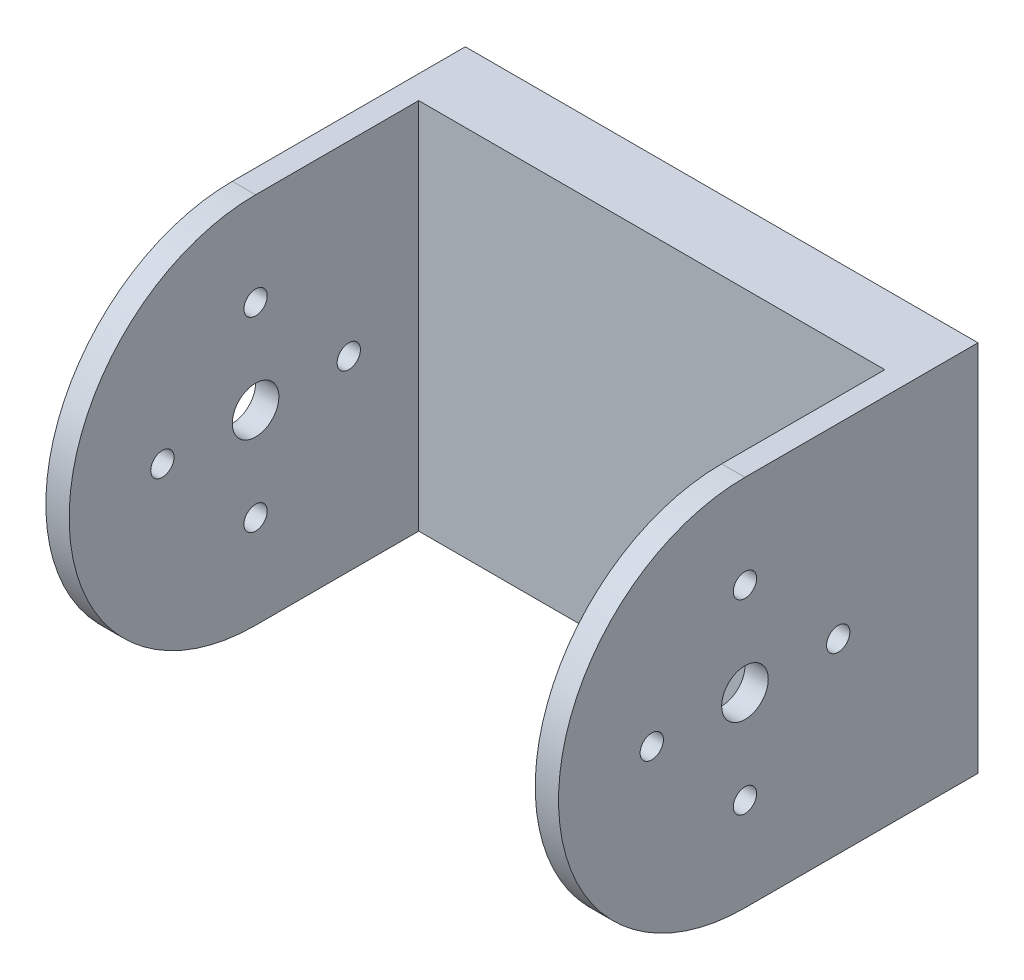
ISO-10303-21;
HEADER;
FILE_DESCRIPTION(('STEP AP214'),'2;1');
FILE_NAME('part.step','',(''),(''),'','','');
FILE_SCHEMA(('AUTOMOTIVE_DESIGN { 1 0 10303 214 1 1 1 1 }'));
ENDSEC;
DATA;
#1=APPLICATION_CONTEXT('core data for automotive mechanical design processes');
#2=APPLICATION_PROTOCOL_DEFINITION('international standard','automotive_design',2000,#1);
#3=PRODUCT_CONTEXT('',#1,'mechanical');
#4=PRODUCT('Part','Part','',(#3));
#5=PRODUCT_RELATED_PRODUCT_CATEGORY('part','',(#4));
#6=PRODUCT_DEFINITION_FORMATION('','',#4);
#7=PRODUCT_DEFINITION_CONTEXT('part definition',#1,'design');
#8=PRODUCT_DEFINITION('design','',#6,#7);
#9=PRODUCT_DEFINITION_SHAPE('','',#8);
#10=(LENGTH_UNIT() NAMED_UNIT(*) SI_UNIT(.MILLI.,.METRE.));
#11=(NAMED_UNIT(*) PLANE_ANGLE_UNIT() SI_UNIT($,.RADIAN.));
#12=(NAMED_UNIT(*) SI_UNIT($,.STERADIAN.) SOLID_ANGLE_UNIT());
#13=UNCERTAINTY_MEASURE_WITH_UNIT(LENGTH_MEASURE(1.E-05),#10,'distance_accuracy_value','');
#14=(GEOMETRIC_REPRESENTATION_CONTEXT(3) GLOBAL_UNCERTAINTY_ASSIGNED_CONTEXT((#13)) GLOBAL_UNIT_ASSIGNED_CONTEXT((#10,
#11,#12)) REPRESENTATION_CONTEXT('',''));
#15=CARTESIAN_POINT('',(0.,0.,0.));
#16=DIRECTION('',(0.,0.,1.));
#17=DIRECTION('',(1.,0.,0.));
#18=AXIS2_PLACEMENT_3D('',#15,#16,#17);
#19=CARTESIAN_POINT('',(-21.9752536401493,88.1786639029527,-225.805095762624));
#20=DIRECTION('',(1.,0.,0.));
#21=DIRECTION('',(0.,0.,-1.));
#22=AXIS2_PLACEMENT_3D('',#19,#20,#21);
#23=CYLINDRICAL_SURFACE('',#22,16.);
#24=DIRECTION('',(1.,0.,0.));
#25=VECTOR('',#24,1.);
#26=CARTESIAN_POINT('',(-21.9752536401493,104.178663902952,-225.805095762624));
#27=LINE('',#26,#25);
#28=CARTESIAN_POINT('',(20.0247463598507,104.178663902952,-225.805095762624));
#29=VERTEX_POINT('',#28);
#30=CARTESIAN_POINT('',(22.0247463598507,104.178663902952,-225.805095762624));
#31=VERTEX_POINT('',#30);
#32=EDGE_CURVE('E25',#29,#31,#27,.T.);
#33=ORIENTED_EDGE('',*,*,#32,.F.);
#34=CARTESIAN_POINT('',(20.0247463598507,88.1786639029527,-225.805095762624));
#35=DIRECTION('',(1.,0.,0.));
#36=DIRECTION('',(0.,0.,-1.));
#37=AXIS2_PLACEMENT_3D('',#34,#35,#36);
#38=CIRCLE('',#37,16.);
#39=CARTESIAN_POINT('',(20.0247463598507,72.1786639029524,-225.805095762624));
#40=VERTEX_POINT('',#39);
#41=EDGE_CURVE('E147',#29,#40,#38,.T.);
#42=ORIENTED_EDGE('',*,*,#41,.T.);
#43=DIRECTION('',(1.,0.,0.));
#44=VECTOR('',#43,1.);
#45=CARTESIAN_POINT('',(-21.9752536401493,72.1786639029525,-225.805095762624));
#46=LINE('',#45,#44);
#47=CARTESIAN_POINT('',(22.0247463598507,72.1786639029524,-225.805095762624));
#48=VERTEX_POINT('',#47);
#49=EDGE_CURVE('E64',#40,#48,#46,.T.);
#50=ORIENTED_EDGE('',*,*,#49,.T.);
#51=CARTESIAN_POINT('',(22.0247463598507,88.1786639029527,-225.805095762624));
#52=DIRECTION('',(-1.,0.,0.));
#53=DIRECTION('',(0.,0.,1.));
#54=AXIS2_PLACEMENT_3D('',#51,#52,#53);
#55=CIRCLE('',#54,16.);
#56=EDGE_CURVE('E177',#48,#31,#55,.T.);
#57=ORIENTED_EDGE('',*,*,#56,.T.);
#58=EDGE_LOOP('',(#33,#42,#50,#57));
#59=FACE_BOUND('',#58,.T.);
#60=ADVANCED_FACE('F16',(#59),#23,.T.);
#61=CARTESIAN_POINT('',(-21.9752536401493,88.1786639029527,-225.805095762624));
#62=DIRECTION('',(1.,0.,0.));
#63=DIRECTION('',(0.,0.,-1.));
#64=AXIS2_PLACEMENT_3D('',#61,#62,#63);
#65=CYLINDRICAL_SURFACE('',#64,2.);
#66=CARTESIAN_POINT('',(20.0247463598507,88.1786639029527,-225.805095762624));
#67=DIRECTION('',(1.,0.,0.));
#68=DIRECTION('',(0.,0.,-1.));
#69=AXIS2_PLACEMENT_3D('',#66,#67,#68);
#70=CIRCLE('',#69,2.);
#71=CARTESIAN_POINT('',(20.0247463598507,88.1786639029527,-227.805095762624));
#72=VERTEX_POINT('',#71);
#73=EDGE_CURVE('E144',#72,#72,#70,.T.);
#74=ORIENTED_EDGE('',*,*,#73,.F.);
#75=EDGE_LOOP('',(#74));
#76=FACE_BOUND('',#75,.T.);
#77=CARTESIAN_POINT('',(22.0247463598507,88.1786639029527,-225.805095762624));
#78=DIRECTION('',(-1.,0.,0.));
#79=DIRECTION('',(0.,0.,1.));
#80=AXIS2_PLACEMENT_3D('',#77,#78,#79);
#81=CIRCLE('',#80,2.);
#82=CARTESIAN_POINT('',(22.0247463598507,88.1786639029527,-223.805095762624));
#83=VERTEX_POINT('',#82);
#84=EDGE_CURVE('E171',#83,#83,#81,.T.);
#85=ORIENTED_EDGE('',*,*,#84,.F.);
#86=EDGE_LOOP('',(#85));
#87=FACE_BOUND('',#86,.T.);
#88=ADVANCED_FACE('F231',(#76,#87),#65,.F.);
#89=CARTESIAN_POINT('',(-21.9752536401493,88.1786639029525,-233.805095762624));
#90=DIRECTION('',(1.,0.,0.));
#91=DIRECTION('',(0.,0.,-1.));
#92=AXIS2_PLACEMENT_3D('',#89,#90,#91);
#93=CYLINDRICAL_SURFACE('',#92,1.);
#94=CARTESIAN_POINT('',(20.0247463598507,88.1786639029524,-233.805095762624));
#95=DIRECTION('',(1.,0.,0.));
#96=DIRECTION('',(0.,0.,-1.));
#97=AXIS2_PLACEMENT_3D('',#94,#95,#96);
#98=CIRCLE('',#97,1.);
#99=CARTESIAN_POINT('',(20.0247463598507,88.1786639029524,-234.805095762624));
#100=VERTEX_POINT('',#99);
#101=EDGE_CURVE('E141',#100,#100,#98,.T.);
#102=ORIENTED_EDGE('',*,*,#101,.F.);
#103=EDGE_LOOP('',(#102));
#104=FACE_BOUND('',#103,.T.);
#105=CARTESIAN_POINT('',(22.0247463598507,88.1786639029524,-233.805095762624));
#106=DIRECTION('',(-1.,0.,0.));
#107=DIRECTION('',(0.,0.,1.));
#108=AXIS2_PLACEMENT_3D('',#105,#106,#107);
#109=CIRCLE('',#108,1.);
#110=CARTESIAN_POINT('',(22.0247463598507,88.1786639029524,-232.805095762624));
#111=VERTEX_POINT('',#110);
#112=EDGE_CURVE('E165',#111,#111,#109,.T.);
#113=ORIENTED_EDGE('',*,*,#112,.F.);
#114=EDGE_LOOP('',(#113));
#115=FACE_BOUND('',#114,.T.);
#116=ADVANCED_FACE('F235',(#104,#115),#93,.F.);
#117=CARTESIAN_POINT('',(-21.9752536401493,96.1786639029525,-225.805095762624));
#118=DIRECTION('',(1.,0.,0.));
#119=DIRECTION('',(0.,0.,-1.));
#120=AXIS2_PLACEMENT_3D('',#117,#118,#119);
#121=CYLINDRICAL_SURFACE('',#120,1.00000000000003);
#122=CARTESIAN_POINT('',(20.0247463598507,96.1786639029525,-225.805095762624));
#123=DIRECTION('',(1.,0.,0.));
#124=DIRECTION('',(0.,0.,-1.));
#125=AXIS2_PLACEMENT_3D('',#122,#123,#124);
#126=CIRCLE('',#125,1.00000000000003);
#127=CARTESIAN_POINT('',(20.0247463598507,96.1786639029525,-226.805095762624));
#128=VERTEX_POINT('',#127);
#129=EDGE_CURVE('E138',#128,#128,#126,.T.);
#130=ORIENTED_EDGE('',*,*,#129,.F.);
#131=EDGE_LOOP('',(#130));
#132=FACE_BOUND('',#131,.T.);
#133=CARTESIAN_POINT('',(22.0247463598507,96.1786639029524,-225.805095762624));
#134=DIRECTION('',(-1.,0.,0.));
#135=DIRECTION('',(0.,0.,1.));
#136=AXIS2_PLACEMENT_3D('',#133,#134,#135);
#137=CIRCLE('',#136,1.00000000000003);
#138=CARTESIAN_POINT('',(22.0247463598507,96.1786639029524,-224.805095762624));
#139=VERTEX_POINT('',#138);
#140=EDGE_CURVE('E159',#139,#139,#137,.T.);
#141=ORIENTED_EDGE('',*,*,#140,.F.);
#142=EDGE_LOOP('',(#141));
#143=FACE_BOUND('',#142,.T.);
#144=ADVANCED_FACE('F268',(#132,#143),#121,.F.);
#145=CARTESIAN_POINT('',(-21.9752536401493,88.1786639029525,-217.805095762624));
#146=DIRECTION('',(1.,0.,0.));
#147=DIRECTION('',(0.,0.,-1.));
#148=AXIS2_PLACEMENT_3D('',#145,#146,#147);
#149=CYLINDRICAL_SURFACE('',#148,1.00000000000005);
#150=CARTESIAN_POINT('',(20.0247463598507,88.1786639029524,-217.805095762624));
#151=DIRECTION('',(1.,0.,0.));
#152=DIRECTION('',(0.,0.,-1.));
#153=AXIS2_PLACEMENT_3D('',#150,#151,#152);
#154=CIRCLE('',#153,1.00000000000005);
#155=CARTESIAN_POINT('',(20.0247463598507,88.1786639029524,-218.805095762624));
#156=VERTEX_POINT('',#155);
#157=EDGE_CURVE('E135',#156,#156,#154,.T.);
#158=ORIENTED_EDGE('',*,*,#157,.F.);
#159=EDGE_LOOP('',(#158));
#160=FACE_BOUND('',#159,.T.);
#161=CARTESIAN_POINT('',(22.0247463598507,88.1786639029524,-217.805095762624));
#162=DIRECTION('',(-1.,0.,0.));
#163=DIRECTION('',(0.,0.,1.));
#164=AXIS2_PLACEMENT_3D('',#161,#162,#163);
#165=CIRCLE('',#164,1.00000000000005);
#166=CARTESIAN_POINT('',(22.0247463598507,88.1786639029524,-216.805095762624));
#167=VERTEX_POINT('',#166);
#168=EDGE_CURVE('E153',#167,#167,#165,.T.);
#169=ORIENTED_EDGE('',*,*,#168,.F.);
#170=EDGE_LOOP('',(#169));
#171=FACE_BOUND('',#170,.T.);
#172=ADVANCED_FACE('F225',(#160,#171),#149,.F.);
#173=CARTESIAN_POINT('',(-21.9752536401493,80.1786639029525,-225.805095762624));
#174=DIRECTION('',(1.,0.,0.));
#175=DIRECTION('',(0.,0.,-1.));
#176=AXIS2_PLACEMENT_3D('',#173,#174,#175);
#177=CYLINDRICAL_SURFACE('',#176,1.00000000000008);
#178=CARTESIAN_POINT('',(20.0247463598507,80.1786639029525,-225.805095762624));
#179=DIRECTION('',(1.,0.,0.));
#180=DIRECTION('',(0.,0.,-1.));
#181=AXIS2_PLACEMENT_3D('',#178,#179,#180);
#182=CIRCLE('',#181,1.00000000000008);
#183=CARTESIAN_POINT('',(20.0247463598507,80.1786639029525,-226.805095762624));
#184=VERTEX_POINT('',#183);
#185=EDGE_CURVE('E20',#184,#184,#182,.T.);
#186=ORIENTED_EDGE('',*,*,#185,.F.);
#187=EDGE_LOOP('',(#186));
#188=FACE_BOUND('',#187,.T.);
#189=CARTESIAN_POINT('',(22.0247463598507,80.1786639029525,-225.805095762624));
#190=DIRECTION('',(-1.,0.,0.));
#191=DIRECTION('',(0.,0.,1.));
#192=AXIS2_PLACEMENT_3D('',#189,#190,#191);
#193=CIRCLE('',#192,1.00000000000008);
#194=CARTESIAN_POINT('',(22.0247463598507,80.1786639029525,-224.805095762624));
#195=VERTEX_POINT('',#194);
#196=EDGE_CURVE('E149',#195,#195,#193,.T.);
#197=ORIENTED_EDGE('',*,*,#196,.F.);
#198=EDGE_LOOP('',(#197));
#199=FACE_BOUND('',#198,.T.);
#200=ADVANCED_FACE('F210',(#188,#199),#177,.F.);
#201=CARTESIAN_POINT('',(-21.9752536401493,88.1786639029527,-225.805095762624));
#202=DIRECTION('',(-1.,0.,0.));
#203=DIRECTION('',(0.,0.,1.));
#204=AXIS2_PLACEMENT_3D('',#201,#202,#203);
#205=PLANE('',#204);
#206=CARTESIAN_POINT('',(-21.9752536401493,88.1786639029525,-217.805095762624));
#207=DIRECTION('',(-1.,0.,0.));
#208=DIRECTION('',(0.,0.,1.));
#209=AXIS2_PLACEMENT_3D('',#206,#207,#208);
#210=CIRCLE('',#209,1.00000000000005);
#211=CARTESIAN_POINT('',(-21.9752536401493,88.1786639029525,-216.805095762624));
#212=VERTEX_POINT('',#211);
#213=EDGE_CURVE('E156',#212,#212,#210,.T.);
#214=ORIENTED_EDGE('',*,*,#213,.F.);
#215=EDGE_LOOP('',(#214));
#216=FACE_BOUND('',#215,.T.);
#217=CARTESIAN_POINT('',(-21.9752536401493,88.1786639029525,-233.805095762624));
#218=DIRECTION('',(-1.,0.,0.));
#219=DIRECTION('',(0.,0.,1.));
#220=AXIS2_PLACEMENT_3D('',#217,#218,#219);
#221=CIRCLE('',#220,1.);
#222=CARTESIAN_POINT('',(-21.9752536401493,88.1786639029525,-232.805095762624));
#223=VERTEX_POINT('',#222);
#224=EDGE_CURVE('E168',#223,#223,#221,.T.);
#225=ORIENTED_EDGE('',*,*,#224,.F.);
#226=EDGE_LOOP('',(#225));
#227=FACE_BOUND('',#226,.T.);
#228=CARTESIAN_POINT('',(-21.9752536401493,88.1786639029527,-225.805095762624));
#229=DIRECTION('',(-1.,0.,0.));
#230=DIRECTION('',(0.,0.,1.));
#231=AXIS2_PLACEMENT_3D('',#228,#229,#230);
#232=CIRCLE('',#231,16.);
#233=CARTESIAN_POINT('',(-21.9752536401493,72.1786639029525,-225.805095762624));
#234=VERTEX_POINT('',#233);
#235=CARTESIAN_POINT('',(-21.9752536401493,104.178663902952,-225.805095762624));
#236=VERTEX_POINT('',#235);
#237=EDGE_CURVE('E180',#234,#236,#232,.T.);
#238=ORIENTED_EDGE('',*,*,#237,.T.);
#239=DIRECTION('',(0.,0.,-1.));
#240=VECTOR('',#239,1.);
#241=CARTESIAN_POINT('',(-21.9752536401493,104.178663902952,-245.805095762624));
#242=LINE('',#241,#240);
#243=CARTESIAN_POINT('',(-21.9752536401493,104.178663902952,-245.805095762624));
#244=VERTEX_POINT('',#243);
#245=EDGE_CURVE('E71',#236,#244,#242,.T.);
#246=ORIENTED_EDGE('',*,*,#245,.T.);
#247=DIRECTION('',(0.,-1.,0.));
#248=VECTOR('',#247,1.);
#249=CARTESIAN_POINT('',(-21.9752536401493,72.1786639029525,-245.805095762624));
#250=LINE('',#249,#248);
#251=CARTESIAN_POINT('',(-21.9752536401493,72.1786639029525,-245.805095762624));
#252=VERTEX_POINT('',#251);
#253=EDGE_CURVE('E184',#244,#252,#250,.T.);
#254=ORIENTED_EDGE('',*,*,#253,.T.);
#255=DIRECTION('',(0.,0.,1.));
#256=VECTOR('',#255,1.);
#257=CARTESIAN_POINT('',(-21.9752536401493,72.1786639029525,-225.805095762624));
#258=LINE('',#257,#256);
#259=EDGE_CURVE('E42',#252,#234,#258,.T.);
#260=ORIENTED_EDGE('',*,*,#259,.T.);
#261=EDGE_LOOP('',(#238,#246,#254,#260));
#262=FACE_BOUND('',#261,.T.);
#263=CARTESIAN_POINT('',(-21.9752536401493,88.1786639029527,-225.805095762624));
#264=DIRECTION('',(-1.,0.,0.));
#265=DIRECTION('',(0.,0.,1.));
#266=AXIS2_PLACEMENT_3D('',#263,#264,#265);
#267=CIRCLE('',#266,2.);
#268=CARTESIAN_POINT('',(-21.9752536401493,88.1786639029527,-223.805095762624));
#269=VERTEX_POINT('',#268);
#270=EDGE_CURVE('E174',#269,#269,#267,.T.);
#271=ORIENTED_EDGE('',*,*,#270,.F.);
#272=EDGE_LOOP('',(#271));
#273=FACE_BOUND('',#272,.T.);
#274=CARTESIAN_POINT('',(-21.9752536401493,96.1786639029525,-225.805095762624));
#275=DIRECTION('',(-1.,0.,0.));
#276=DIRECTION('',(0.,0.,1.));
#277=AXIS2_PLACEMENT_3D('',#274,#275,#276);
#278=CIRCLE('',#277,1.00000000000003);
#279=CARTESIAN_POINT('',(-21.9752536401493,96.1786639029525,-224.805095762624));
#280=VERTEX_POINT('',#279);
#281=EDGE_CURVE('E162',#280,#280,#278,.T.);
#282=ORIENTED_EDGE('',*,*,#281,.F.);
#283=EDGE_LOOP('',(#282));
#284=FACE_BOUND('',#283,.T.);
#285=CARTESIAN_POINT('',(-21.9752536401493,80.1786639029525,-225.805095762624));
#286=DIRECTION('',(-1.,0.,0.));
#287=DIRECTION('',(0.,0.,1.));
#288=AXIS2_PLACEMENT_3D('',#285,#286,#287);
#289=CIRCLE('',#288,1.00000000000008);
#290=CARTESIAN_POINT('',(-21.9752536401493,80.1786639029525,-224.805095762624));
#291=VERTEX_POINT('',#290);
#292=EDGE_CURVE('E150',#291,#291,#289,.T.);
#293=ORIENTED_EDGE('',*,*,#292,.F.);
#294=EDGE_LOOP('',(#293));
#295=FACE_BOUND('',#294,.T.);
#296=ADVANCED_FACE('F213',(#216,#227,#262,#273,#284,#295),#205,.T.);
#297=CARTESIAN_POINT('',(22.0247463598507,88.1786639029527,-225.805095762624));
#298=DIRECTION('',(-1.,0.,0.));
#299=DIRECTION('',(0.,0.,1.));
#300=AXIS2_PLACEMENT_3D('',#297,#298,#299);
#301=PLANE('',#300);
#302=ORIENTED_EDGE('',*,*,#56,.F.);
#303=DIRECTION('',(0.,0.,1.));
#304=VECTOR('',#303,1.);
#305=CARTESIAN_POINT('',(22.0247463598507,72.1786639029524,-225.805095762624));
#306=LINE('',#305,#304);
#307=CARTESIAN_POINT('',(22.0247463598507,72.1786639029524,-245.805095762624));
#308=VERTEX_POINT('',#307);
#309=EDGE_CURVE('E182',#308,#48,#306,.T.);
#310=ORIENTED_EDGE('',*,*,#309,.F.);
#311=DIRECTION('',(0.,-1.,0.));
#312=VECTOR('',#311,1.);
#313=CARTESIAN_POINT('',(22.0247463598507,72.1786639029524,-245.805095762624));
#314=LINE('',#313,#312);
#315=CARTESIAN_POINT('',(22.0247463598507,104.178663902952,-245.805095762624));
#316=VERTEX_POINT('',#315);
#317=EDGE_CURVE('E190',#316,#308,#314,.T.);
#318=ORIENTED_EDGE('',*,*,#317,.F.);
#319=DIRECTION('',(0.,0.,-1.));
#320=VECTOR('',#319,1.);
#321=CARTESIAN_POINT('',(22.0247463598507,104.178663902952,-245.805095762624));
#322=LINE('',#321,#320);
#323=EDGE_CURVE('E188',#31,#316,#322,.T.);
#324=ORIENTED_EDGE('',*,*,#323,.F.);
#325=EDGE_LOOP('',(#302,#310,#318,#324));
#326=FACE_BOUND('',#325,.T.);
#327=ORIENTED_EDGE('',*,*,#84,.T.);
#328=EDGE_LOOP('',(#327));
#329=FACE_BOUND('',#328,.T.);
#330=ORIENTED_EDGE('',*,*,#112,.T.);
#331=EDGE_LOOP('',(#330));
#332=FACE_BOUND('',#331,.T.);
#333=ORIENTED_EDGE('',*,*,#140,.T.);
#334=EDGE_LOOP('',(#333));
#335=FACE_BOUND('',#334,.T.);
#336=ORIENTED_EDGE('',*,*,#168,.T.);
#337=EDGE_LOOP('',(#336));
#338=FACE_BOUND('',#337,.T.);
#339=ORIENTED_EDGE('',*,*,#196,.T.);
#340=EDGE_LOOP('',(#339));
#341=FACE_BOUND('',#340,.T.);
#342=ADVANCED_FACE('F215',(#326,#329,#332,#335,#338,#341),#301,.F.);
#343=CARTESIAN_POINT('',(-19.9752536401493,88.1786639029527,-225.805095762624));
#344=DIRECTION('',(-1.,0.,0.));
#345=DIRECTION('',(0.,0.,1.));
#346=AXIS2_PLACEMENT_3D('',#343,#344,#345);
#347=CIRCLE('',#346,16.);
#348=CARTESIAN_POINT('',(-19.9752536401493,72.1786639029525,-225.805095762624));
#349=VERTEX_POINT('',#348);
#350=CARTESIAN_POINT('',(-19.9752536401493,104.178663902952,-225.805095762624));
#351=VERTEX_POINT('',#350);
#352=EDGE_CURVE('E33',#349,#351,#347,.T.);
#353=ORIENTED_EDGE('',*,*,#352,.T.);
#354=EDGE_CURVE('E10',#236,#351,#27,.T.);
#355=ORIENTED_EDGE('',*,*,#354,.F.);
#356=ORIENTED_EDGE('',*,*,#237,.F.);
#357=EDGE_CURVE('E193',#234,#349,#46,.T.);
#358=ORIENTED_EDGE('',*,*,#357,.T.);
#359=EDGE_LOOP('',(#353,#355,#356,#358));
#360=FACE_BOUND('',#359,.T.);
#361=ADVANCED_FACE('F18',(#360),#23,.T.);
#362=CARTESIAN_POINT('',(-21.9752536401493,104.178663902952,-245.805095762624));
#363=DIRECTION('',(0.,-1.,0.));
#364=DIRECTION('',(0.,0.,1.));
#365=AXIS2_PLACEMENT_3D('',#362,#363,#364);
#366=PLANE('',#365);
#367=DIRECTION('',(-1.,0.,0.));
#368=VECTOR('',#367,1.);
#369=CARTESIAN_POINT('',(-19.9752536401493,104.178663902952,-239.805095762624));
#370=LINE('',#369,#368);
#371=CARTESIAN_POINT('',(20.0247463598507,104.178663902952,-239.805095762624));
#372=VERTEX_POINT('',#371);
#373=CARTESIAN_POINT('',(-19.9752536401493,104.178663902952,-239.805095762624));
#374=VERTEX_POINT('',#373);
#375=EDGE_CURVE('E100',#372,#374,#370,.T.);
#376=ORIENTED_EDGE('',*,*,#375,.F.);
#377=DIRECTION('',(0.,0.,-1.));
#378=VECTOR('',#377,1.);
#379=CARTESIAN_POINT('',(20.0247463598507,104.178663902952,-209.805095762624));
#380=LINE('',#379,#378);
#381=EDGE_CURVE('E112',#29,#372,#380,.T.);
#382=ORIENTED_EDGE('',*,*,#381,.F.);
#383=ORIENTED_EDGE('',*,*,#32,.T.);
#384=ORIENTED_EDGE('',*,*,#323,.T.);
#385=DIRECTION('',(1.,0.,0.));
#386=VECTOR('',#385,1.);
#387=CARTESIAN_POINT('',(-21.9752536401493,104.178663902952,-245.805095762624));
#388=LINE('',#387,#386);
#389=EDGE_CURVE('E198',#244,#316,#388,.T.);
#390=ORIENTED_EDGE('',*,*,#389,.F.);
#391=ORIENTED_EDGE('',*,*,#245,.F.);
#392=ORIENTED_EDGE('',*,*,#354,.T.);
#393=DIRECTION('',(0.,0.,1.));
#394=VECTOR('',#393,1.);
#395=CARTESIAN_POINT('',(-19.9752536401493,104.178663902952,-209.805095762624));
#396=LINE('',#395,#394);
#397=EDGE_CURVE('E114',#374,#351,#396,.T.);
#398=ORIENTED_EDGE('',*,*,#397,.F.);
#399=EDGE_LOOP('',(#376,#382,#383,#384,#390,#391,#392,#398));
#400=FACE_BOUND('',#399,.T.);
#401=ADVANCED_FACE('F240',(#400),#366,.F.);
#402=CARTESIAN_POINT('',(-21.9752536401493,72.1786639029525,-245.805095762624));
#403=DIRECTION('',(0.,0.,1.));
#404=DIRECTION('',(0.,1.,0.));
#405=AXIS2_PLACEMENT_3D('',#402,#403,#404);
#406=PLANE('',#405);
#407=ORIENTED_EDGE('',*,*,#317,.T.);
#408=DIRECTION('',(1.,0.,0.));
#409=VECTOR('',#408,1.);
#410=CARTESIAN_POINT('',(-21.9752536401493,72.1786639029525,-245.805095762624));
#411=LINE('',#410,#409);
#412=EDGE_CURVE('E195',#252,#308,#411,.T.);
#413=ORIENTED_EDGE('',*,*,#412,.F.);
#414=ORIENTED_EDGE('',*,*,#253,.F.);
#415=ORIENTED_EDGE('',*,*,#389,.T.);
#416=EDGE_LOOP('',(#407,#413,#414,#415));
#417=FACE_BOUND('',#416,.T.);
#418=ADVANCED_FACE('F245',(#417),#406,.F.);
#419=CARTESIAN_POINT('',(-21.9752536401493,72.1786639029525,-225.805095762624));
#420=DIRECTION('',(0.,1.,0.));
#421=DIRECTION('',(0.,0.,-1.));
#422=AXIS2_PLACEMENT_3D('',#419,#420,#421);
#423=PLANE('',#422);
#424=ORIENTED_EDGE('',*,*,#49,.F.);
#425=DIRECTION('',(0.,0.,-1.));
#426=VECTOR('',#425,1.);
#427=CARTESIAN_POINT('',(20.0247463598507,72.1786639029524,-209.805095762624));
#428=LINE('',#427,#426);
#429=CARTESIAN_POINT('',(20.0247463598507,72.1786639029524,-239.805095762624));
#430=VERTEX_POINT('',#429);
#431=EDGE_CURVE('E103',#40,#430,#428,.T.);
#432=ORIENTED_EDGE('',*,*,#431,.T.);
#433=DIRECTION('',(-1.,0.,0.));
#434=VECTOR('',#433,1.);
#435=CARTESIAN_POINT('',(-19.9752536401493,72.1786639029524,-239.805095762624));
#436=LINE('',#435,#434);
#437=CARTESIAN_POINT('',(-19.9752536401493,72.1786639029524,-239.805095762624));
#438=VERTEX_POINT('',#437);
#439=EDGE_CURVE('E97',#430,#438,#436,.T.);
#440=ORIENTED_EDGE('',*,*,#439,.T.);
#441=DIRECTION('',(0.,0.,1.));
#442=VECTOR('',#441,1.);
#443=CARTESIAN_POINT('',(-19.9752536401493,72.1786639029525,-209.805095762624));
#444=LINE('',#443,#442);
#445=EDGE_CURVE('E105',#438,#349,#444,.T.);
#446=ORIENTED_EDGE('',*,*,#445,.T.);
#447=ORIENTED_EDGE('',*,*,#357,.F.);
#448=ORIENTED_EDGE('',*,*,#259,.F.);
#449=ORIENTED_EDGE('',*,*,#412,.T.);
#450=ORIENTED_EDGE('',*,*,#309,.T.);
#451=EDGE_LOOP('',(#424,#432,#440,#446,#447,#448,#449,#450));
#452=FACE_BOUND('',#451,.T.);
#453=ADVANCED_FACE('F110',(#452),#423,.F.);
#454=CARTESIAN_POINT('',(-19.9752536401493,88.1786639029527,-225.805095762624));
#455=DIRECTION('',(-1.,0.,0.));
#456=DIRECTION('',(0.,0.,1.));
#457=AXIS2_PLACEMENT_3D('',#454,#455,#456);
#458=CIRCLE('',#457,2.);
#459=CARTESIAN_POINT('',(-19.9752536401493,88.1786639029527,-223.805095762624));
#460=VERTEX_POINT('',#459);
#461=EDGE_CURVE('E131',#460,#460,#458,.T.);
#462=ORIENTED_EDGE('',*,*,#461,.F.);
#463=EDGE_LOOP('',(#462));
#464=FACE_BOUND('',#463,.T.);
#465=ORIENTED_EDGE('',*,*,#270,.T.);
#466=EDGE_LOOP('',(#465));
#467=FACE_BOUND('',#466,.T.);
#468=ADVANCED_FACE('F237',(#464,#467),#65,.F.);
#469=CARTESIAN_POINT('',(-19.9752536401493,88.1786639029525,-233.805095762624));
#470=DIRECTION('',(-1.,0.,0.));
#471=DIRECTION('',(0.,0.,1.));
#472=AXIS2_PLACEMENT_3D('',#469,#470,#471);
#473=CIRCLE('',#472,1.);
#474=CARTESIAN_POINT('',(-19.9752536401493,88.1786639029525,-232.805095762624));
#475=VERTEX_POINT('',#474);
#476=EDGE_CURVE('E128',#475,#475,#473,.T.);
#477=ORIENTED_EDGE('',*,*,#476,.F.);
#478=EDGE_LOOP('',(#477));
#479=FACE_BOUND('',#478,.T.);
#480=ORIENTED_EDGE('',*,*,#224,.T.);
#481=EDGE_LOOP('',(#480));
#482=FACE_BOUND('',#481,.T.);
#483=ADVANCED_FACE('F265',(#479,#482),#93,.F.);
#484=CARTESIAN_POINT('',(-19.9752536401493,96.1786639029525,-225.805095762624));
#485=DIRECTION('',(-1.,0.,0.));
#486=DIRECTION('',(0.,0.,1.));
#487=AXIS2_PLACEMENT_3D('',#484,#485,#486);
#488=CIRCLE('',#487,1.00000000000003);
#489=CARTESIAN_POINT('',(-19.9752536401493,96.1786639029525,-224.805095762624));
#490=VERTEX_POINT('',#489);
#491=EDGE_CURVE('E125',#490,#490,#488,.T.);
#492=ORIENTED_EDGE('',*,*,#491,.F.);
#493=EDGE_LOOP('',(#492));
#494=FACE_BOUND('',#493,.T.);
#495=ORIENTED_EDGE('',*,*,#281,.T.);
#496=EDGE_LOOP('',(#495));
#497=FACE_BOUND('',#496,.T.);
#498=ADVANCED_FACE('F263',(#494,#497),#121,.F.);
#499=CARTESIAN_POINT('',(-19.9752536401493,88.1786639029525,-217.805095762624));
#500=DIRECTION('',(-1.,0.,0.));
#501=DIRECTION('',(0.,0.,1.));
#502=AXIS2_PLACEMENT_3D('',#499,#500,#501);
#503=CIRCLE('',#502,1.00000000000005);
#504=CARTESIAN_POINT('',(-19.9752536401493,88.1786639029525,-216.805095762624));
#505=VERTEX_POINT('',#504);
#506=EDGE_CURVE('E122',#505,#505,#503,.T.);
#507=ORIENTED_EDGE('',*,*,#506,.F.);
#508=EDGE_LOOP('',(#507));
#509=FACE_BOUND('',#508,.T.);
#510=ORIENTED_EDGE('',*,*,#213,.T.);
#511=EDGE_LOOP('',(#510));
#512=FACE_BOUND('',#511,.T.);
#513=ADVANCED_FACE('F208',(#509,#512),#149,.F.);
#514=CARTESIAN_POINT('',(-19.9752536401493,80.1786639029525,-225.805095762624));
#515=DIRECTION('',(-1.,0.,0.));
#516=DIRECTION('',(0.,0.,1.));
#517=AXIS2_PLACEMENT_3D('',#514,#515,#516);
#518=CIRCLE('',#517,1.00000000000008);
#519=CARTESIAN_POINT('',(-19.9752536401493,80.1786639029525,-224.805095762624));
#520=VERTEX_POINT('',#519);
#521=EDGE_CURVE('E120',#520,#520,#518,.T.);
#522=ORIENTED_EDGE('',*,*,#521,.F.);
#523=EDGE_LOOP('',(#522));
#524=FACE_BOUND('',#523,.T.);
#525=ORIENTED_EDGE('',*,*,#292,.T.);
#526=EDGE_LOOP('',(#525));
#527=FACE_BOUND('',#526,.T.);
#528=ADVANCED_FACE('F204',(#524,#527),#177,.F.);
#529=CARTESIAN_POINT('',(20.0247463598507,72.1786639029524,-209.805095762624));
#530=DIRECTION('',(1.,0.,0.));
#531=DIRECTION('',(0.,0.,-1.));
#532=AXIS2_PLACEMENT_3D('',#529,#530,#531);
#533=PLANE('',#532);
#534=ORIENTED_EDGE('',*,*,#73,.T.);
#535=EDGE_LOOP('',(#534));
#536=FACE_BOUND('',#535,.T.);
#537=ORIENTED_EDGE('',*,*,#101,.T.);
#538=EDGE_LOOP('',(#537));
#539=FACE_BOUND('',#538,.T.);
#540=ORIENTED_EDGE('',*,*,#129,.T.);
#541=EDGE_LOOP('',(#540));
#542=FACE_BOUND('',#541,.T.);
#543=ORIENTED_EDGE('',*,*,#157,.T.);
#544=EDGE_LOOP('',(#543));
#545=FACE_BOUND('',#544,.T.);
#546=ORIENTED_EDGE('',*,*,#185,.T.);
#547=EDGE_LOOP('',(#546));
#548=FACE_BOUND('',#547,.T.);
#549=ORIENTED_EDGE('',*,*,#381,.T.);
#550=DIRECTION('',(0.,1.,0.));
#551=VECTOR('',#550,1.);
#552=CARTESIAN_POINT('',(20.0247463598507,72.1786639029524,-239.805095762624));
#553=LINE('',#552,#551);
#554=EDGE_CURVE('E102',#430,#372,#553,.T.);
#555=ORIENTED_EDGE('',*,*,#554,.F.);
#556=ORIENTED_EDGE('',*,*,#431,.F.);
#557=ORIENTED_EDGE('',*,*,#41,.F.);
#558=EDGE_LOOP('',(#549,#555,#556,#557));
#559=FACE_BOUND('',#558,.T.);
#560=ADVANCED_FACE('F207',(#536,#539,#542,#545,#548,#559),#533,.F.);
#561=CARTESIAN_POINT('',(-19.9752536401493,72.1786639029525,-209.805095762624));
#562=DIRECTION('',(-1.,0.,0.));
#563=DIRECTION('',(0.,0.,1.));
#564=AXIS2_PLACEMENT_3D('',#561,#562,#563);
#565=PLANE('',#564);
#566=ORIENTED_EDGE('',*,*,#461,.T.);
#567=EDGE_LOOP('',(#566));
#568=FACE_BOUND('',#567,.T.);
#569=ORIENTED_EDGE('',*,*,#476,.T.);
#570=EDGE_LOOP('',(#569));
#571=FACE_BOUND('',#570,.T.);
#572=ORIENTED_EDGE('',*,*,#491,.T.);
#573=EDGE_LOOP('',(#572));
#574=FACE_BOUND('',#573,.T.);
#575=ORIENTED_EDGE('',*,*,#506,.T.);
#576=EDGE_LOOP('',(#575));
#577=FACE_BOUND('',#576,.T.);
#578=ORIENTED_EDGE('',*,*,#521,.T.);
#579=EDGE_LOOP('',(#578));
#580=FACE_BOUND('',#579,.T.);
#581=ORIENTED_EDGE('',*,*,#352,.F.);
#582=ORIENTED_EDGE('',*,*,#445,.F.);
#583=DIRECTION('',(0.,1.,0.));
#584=VECTOR('',#583,1.);
#585=CARTESIAN_POINT('',(-19.9752536401493,72.1786639029524,-239.805095762624));
#586=LINE('',#585,#584);
#587=EDGE_CURVE('E93',#438,#374,#586,.T.);
#588=ORIENTED_EDGE('',*,*,#587,.T.);
#589=ORIENTED_EDGE('',*,*,#397,.T.);
#590=EDGE_LOOP('',(#581,#582,#588,#589));
#591=FACE_BOUND('',#590,.T.);
#592=ADVANCED_FACE('F106',(#568,#571,#574,#577,#580,#591),#565,.F.);
#593=CARTESIAN_POINT('',(-19.9752536401493,72.1786639029524,-239.805095762624));
#594=DIRECTION('',(0.,0.,-1.));
#595=DIRECTION('',(0.,-1.,0.));
#596=AXIS2_PLACEMENT_3D('',#593,#594,#595);
#597=PLANE('',#596);
#598=ORIENTED_EDGE('',*,*,#375,.T.);
#599=ORIENTED_EDGE('',*,*,#587,.F.);
#600=ORIENTED_EDGE('',*,*,#439,.F.);
#601=ORIENTED_EDGE('',*,*,#554,.T.);
#602=EDGE_LOOP('',(#598,#599,#600,#601));
#603=FACE_BOUND('',#602,.T.);
#604=ADVANCED_FACE('F94',(#603),#597,.F.);
#605=CLOSED_SHELL('',(#60,#88,#116,#144,#172,#200,#296,#342,#361,#401,#418,#453,#468,#483,#498,
#513,#528,#560,#592,#604));
#606=MANIFOLD_SOLID_BREP('B1',#605);
#607=ADVANCED_BREP_SHAPE_REPRESENTATION('',(#18,#606),#14);
#608=SHAPE_DEFINITION_REPRESENTATION(#9,#607);
ENDSEC;
END-ISO-10303-21;
